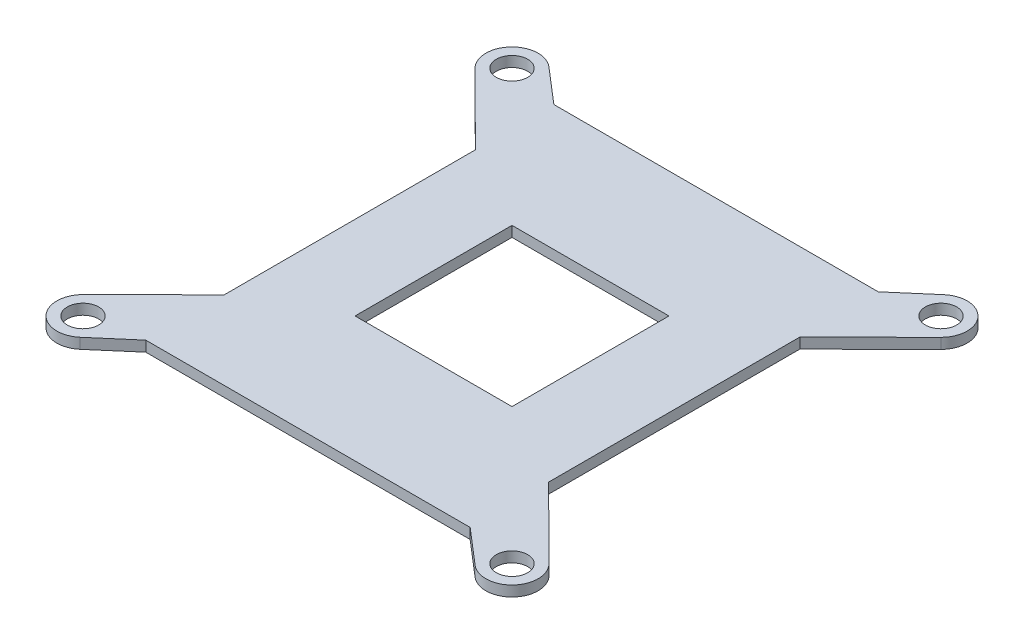
ISO-10303-21;
HEADER;
FILE_DESCRIPTION(('STEP AP214'),'2;1');
FILE_NAME('part.step','',(''),(''),'','','');
FILE_SCHEMA(('AUTOMOTIVE_DESIGN { 1 0 10303 214 1 1 1 1 }'));
ENDSEC;
DATA;
#1=APPLICATION_CONTEXT('core data for automotive mechanical design processes');
#2=APPLICATION_PROTOCOL_DEFINITION('international standard','automotive_design',2000,#1);
#3=PRODUCT_CONTEXT('',#1,'mechanical');
#4=PRODUCT('Part','Part','',(#3));
#5=PRODUCT_RELATED_PRODUCT_CATEGORY('part','',(#4));
#6=PRODUCT_DEFINITION_FORMATION('','',#4);
#7=PRODUCT_DEFINITION_CONTEXT('part definition',#1,'design');
#8=PRODUCT_DEFINITION('design','',#6,#7);
#9=PRODUCT_DEFINITION_SHAPE('','',#8);
#10=(LENGTH_UNIT() NAMED_UNIT(*) SI_UNIT(.MILLI.,.METRE.));
#11=(NAMED_UNIT(*) PLANE_ANGLE_UNIT() SI_UNIT($,.RADIAN.));
#12=(NAMED_UNIT(*) SI_UNIT($,.STERADIAN.) SOLID_ANGLE_UNIT());
#13=UNCERTAINTY_MEASURE_WITH_UNIT(LENGTH_MEASURE(1.E-05),#10,'distance_accuracy_value','');
#14=(GEOMETRIC_REPRESENTATION_CONTEXT(3) GLOBAL_UNCERTAINTY_ASSIGNED_CONTEXT((#13)) GLOBAL_UNIT_ASSIGNED_CONTEXT((#10,
#11,#12)) REPRESENTATION_CONTEXT('',''));
#15=CARTESIAN_POINT('',(0.,0.,0.));
#16=DIRECTION('',(0.,0.,1.));
#17=DIRECTION('',(1.,0.,0.));
#18=AXIS2_PLACEMENT_3D('',#15,#16,#17);
#19=CARTESIAN_POINT('',(41.0000000000008,2.,41.));
#20=DIRECTION('',(0.,1.,0.));
#21=DIRECTION('',(0.,0.,1.));
#22=AXIS2_PLACEMENT_3D('',#19,#20,#21);
#23=PLANE('',#22);
#24=CARTESIAN_POINT('',(41.,2.,41.));
#25=DIRECTION('',(0.,1.,0.));
#26=DIRECTION('',(0.,0.,1.));
#27=AXIS2_PLACEMENT_3D('',#24,#25,#26);
#28=CIRCLE('',#27,3.00000000000082);
#29=CARTESIAN_POINT('',(41.,2.,44.0000000000008));
#30=VERTEX_POINT('',#29);
#31=EDGE_CURVE('E636',#30,#30,#28,.T.);
#32=ORIENTED_EDGE('',*,*,#31,.F.);
#33=EDGE_LOOP('',(#32));
#34=FACE_BOUND('',#33,.T.);
#35=DIRECTION('',(-1.,0.,0.));
#36=VECTOR('',#35,1.);
#37=CARTESIAN_POINT('',(-15.,2.,-15.));
#38=LINE('',#37,#36);
#39=CARTESIAN_POINT('',(15.,2.,-15.));
#40=VERTEX_POINT('',#39);
#41=CARTESIAN_POINT('',(-15.,2.,-15.));
#42=VERTEX_POINT('',#41);
#43=EDGE_CURVE('E178',#40,#42,#38,.T.);
#44=ORIENTED_EDGE('',*,*,#43,.F.);
#45=DIRECTION('',(0.,0.,-1.));
#46=VECTOR('',#45,1.);
#47=CARTESIAN_POINT('',(15.,2.,-15.));
#48=LINE('',#47,#46);
#49=CARTESIAN_POINT('',(15.,2.,15.));
#50=VERTEX_POINT('',#49);
#51=EDGE_CURVE('E170',#50,#40,#48,.T.);
#52=ORIENTED_EDGE('',*,*,#51,.F.);
#53=DIRECTION('',(1.,0.,0.));
#54=VECTOR('',#53,1.);
#55=CARTESIAN_POINT('',(-15.,2.,15.));
#56=LINE('',#55,#54);
#57=CARTESIAN_POINT('',(-15.,2.,15.));
#58=VERTEX_POINT('',#57);
#59=EDGE_CURVE('E193',#58,#50,#56,.T.);
#60=ORIENTED_EDGE('',*,*,#59,.F.);
#61=DIRECTION('',(0.,0.,1.));
#62=VECTOR('',#61,1.);
#63=CARTESIAN_POINT('',(-15.,2.,-15.));
#64=LINE('',#63,#62);
#65=EDGE_CURVE('E191',#42,#58,#64,.T.);
#66=ORIENTED_EDGE('',*,*,#65,.F.);
#67=EDGE_LOOP('',(#44,#52,#60,#66));
#68=FACE_BOUND('',#67,.T.);
#69=CARTESIAN_POINT('',(-41.,2.,-41.));
#70=DIRECTION('',(0.,1.,0.));
#71=DIRECTION('',(0.,0.,1.));
#72=AXIS2_PLACEMENT_3D('',#69,#70,#71);
#73=CIRCLE('',#72,3.);
#74=CARTESIAN_POINT('',(-41.,2.,-38.));
#75=VERTEX_POINT('',#74);
#76=EDGE_CURVE('E209',#75,#75,#73,.T.);
#77=ORIENTED_EDGE('',*,*,#76,.F.);
#78=EDGE_LOOP('',(#77));
#79=FACE_BOUND('',#78,.T.);
#80=DIRECTION('',(0.758480232434231,0.,0.651696046486792));
#81=VECTOR('',#80,1.);
#82=CARTESIAN_POINT('',(31.,2.,39.));
#83=LINE('',#82,#81);
#84=CARTESIAN_POINT('',(31.,2.,39.));
#85=VERTEX_POINT('',#84);
#86=CARTESIAN_POINT('',(37.7415197675669,2.,44.7924011621712));
#87=VERTEX_POINT('',#86);
#88=EDGE_CURVE('E215',#85,#87,#83,.T.);
#89=ORIENTED_EDGE('',*,*,#88,.T.);
#90=CARTESIAN_POINT('',(41.0000000000008,2.,41.));
#91=DIRECTION('',(0.,1.,0.));
#92=DIRECTION('',(0.,0.,1.));
#93=AXIS2_PLACEMENT_3D('',#90,#91,#92);
#94=CIRCLE('',#93,5.);
#95=CARTESIAN_POINT('',(44.5262124483524,2.,37.4551691480283));
#96=VERTEX_POINT('',#95);
#97=EDGE_CURVE('E218',#87,#96,#94,.T.);
#98=ORIENTED_EDGE('',*,*,#97,.T.);
#99=DIRECTION('',(-0.708966170394338,0.,-0.705242489670317));
#100=VECTOR('',#99,1.);
#101=CARTESIAN_POINT('',(31.,2.,24.));
#102=LINE('',#101,#100);
#103=CARTESIAN_POINT('',(31.,2.,24.));
#104=VERTEX_POINT('',#103);
#105=EDGE_CURVE('E221',#96,#104,#102,.T.);
#106=ORIENTED_EDGE('',*,*,#105,.T.);
#107=DIRECTION('',(0.,0.,-1.));
#108=VECTOR('',#107,1.);
#109=CARTESIAN_POINT('',(31.,2.,-24.));
#110=LINE('',#109,#108);
#111=CARTESIAN_POINT('',(31.,2.,-24.));
#112=VERTEX_POINT('',#111);
#113=EDGE_CURVE('E223',#104,#112,#110,.T.);
#114=ORIENTED_EDGE('',*,*,#113,.T.);
#115=DIRECTION('',(0.708966170394317,0.,-0.705242489670338));
#116=VECTOR('',#115,1.);
#117=CARTESIAN_POINT('',(31.,2.,-24.));
#118=LINE('',#117,#116);
#119=CARTESIAN_POINT('',(44.5262124483517,2.,-37.4551691480284));
#120=VERTEX_POINT('',#119);
#121=EDGE_CURVE('E225',#112,#120,#118,.T.);
#122=ORIENTED_EDGE('',*,*,#121,.T.);
#123=CARTESIAN_POINT('',(41.,2.,-41.));
#124=DIRECTION('',(0.,1.,0.));
#125=DIRECTION('',(0.,0.,1.));
#126=AXIS2_PLACEMENT_3D('',#123,#124,#125);
#127=CIRCLE('',#126,5.);
#128=CARTESIAN_POINT('',(37.7415197675658,2.,-44.7924011621709));
#129=VERTEX_POINT('',#128);
#130=EDGE_CURVE('E227',#120,#129,#127,.T.);
#131=ORIENTED_EDGE('',*,*,#130,.T.);
#132=DIRECTION('',(-0.758480232434191,0.,0.651696046486839));
#133=VECTOR('',#132,1.);
#134=CARTESIAN_POINT('',(31.,2.,-39.));
#135=LINE('',#134,#133);
#136=CARTESIAN_POINT('',(31.,2.,-39.));
#137=VERTEX_POINT('',#136);
#138=EDGE_CURVE('E229',#129,#137,#135,.T.);
#139=ORIENTED_EDGE('',*,*,#138,.T.);
#140=DIRECTION('',(-1.,0.,0.));
#141=VECTOR('',#140,1.);
#142=CARTESIAN_POINT('',(-31.,2.,-39.));
#143=LINE('',#142,#141);
#144=CARTESIAN_POINT('',(-31.,2.,-39.));
#145=VERTEX_POINT('',#144);
#146=EDGE_CURVE('E231',#137,#145,#143,.T.);
#147=ORIENTED_EDGE('',*,*,#146,.T.);
#148=DIRECTION('',(-0.758480232434192,0.,-0.651696046486837));
#149=VECTOR('',#148,1.);
#150=CARTESIAN_POINT('',(-31.,2.,-39.));
#151=LINE('',#150,#149);
#152=CARTESIAN_POINT('',(-37.7415197675658,2.,-44.792401162171));
#153=VERTEX_POINT('',#152);
#154=EDGE_CURVE('E233',#145,#153,#151,.T.);
#155=ORIENTED_EDGE('',*,*,#154,.T.);
#156=CARTESIAN_POINT('',(-41.,2.,-41.));
#157=DIRECTION('',(0.,1.,0.));
#158=DIRECTION('',(0.,0.,1.));
#159=AXIS2_PLACEMENT_3D('',#156,#157,#158);
#160=CIRCLE('',#159,5.00000000000001);
#161=CARTESIAN_POINT('',(-44.5262124483517,2.,-37.4551691480284));
#162=VERTEX_POINT('',#161);
#163=EDGE_CURVE('E235',#153,#162,#160,.T.);
#164=ORIENTED_EDGE('',*,*,#163,.T.);
#165=DIRECTION('',(0.708966170394318,0.,0.705242489670337));
#166=VECTOR('',#165,1.);
#167=CARTESIAN_POINT('',(-31.,2.,-24.));
#168=LINE('',#167,#166);
#169=CARTESIAN_POINT('',(-31.,2.,-24.));
#170=VERTEX_POINT('',#169);
#171=EDGE_CURVE('E237',#162,#170,#168,.T.);
#172=ORIENTED_EDGE('',*,*,#171,.T.);
#173=DIRECTION('',(0.,0.,1.));
#174=VECTOR('',#173,1.);
#175=CARTESIAN_POINT('',(-31.,2.,-24.));
#176=LINE('',#175,#174);
#177=CARTESIAN_POINT('',(-31.,2.,24.));
#178=VERTEX_POINT('',#177);
#179=EDGE_CURVE('E239',#170,#178,#176,.T.);
#180=ORIENTED_EDGE('',*,*,#179,.T.);
#181=DIRECTION('',(-0.708966170394295,0.,0.70524248967036));
#182=VECTOR('',#181,1.);
#183=CARTESIAN_POINT('',(-31.,2.,24.));
#184=LINE('',#183,#182);
#185=CARTESIAN_POINT('',(-44.526212448351,2.,37.4551691480285));
#186=VERTEX_POINT('',#185);
#187=EDGE_CURVE('E241',#178,#186,#184,.T.);
#188=ORIENTED_EDGE('',*,*,#187,.T.);
#189=CARTESIAN_POINT('',(-40.9999999999992,2.,41.));
#190=DIRECTION('',(0.,1.,0.));
#191=DIRECTION('',(0.,0.,1.));
#192=AXIS2_PLACEMENT_3D('',#189,#190,#191);
#193=CIRCLE('',#192,5.);
#194=CARTESIAN_POINT('',(-37.7415197675647,2.,44.7924011621708));
#195=VERTEX_POINT('',#194);
#196=EDGE_CURVE('E243',#186,#195,#193,.T.);
#197=ORIENTED_EDGE('',*,*,#196,.T.);
#198=DIRECTION('',(0.758480232434151,0.,-0.651696046486885));
#199=VECTOR('',#198,1.);
#200=CARTESIAN_POINT('',(-31.,2.,39.));
#201=LINE('',#200,#199);
#202=CARTESIAN_POINT('',(-31.,2.,39.));
#203=VERTEX_POINT('',#202);
#204=EDGE_CURVE('E245',#195,#203,#201,.T.);
#205=ORIENTED_EDGE('',*,*,#204,.T.);
#206=DIRECTION('',(1.,0.,0.));
#207=VECTOR('',#206,1.);
#208=CARTESIAN_POINT('',(-31.,2.,39.));
#209=LINE('',#208,#207);
#210=EDGE_CURVE('E247',#203,#85,#209,.T.);
#211=ORIENTED_EDGE('',*,*,#210,.T.);
#212=EDGE_LOOP('',(#89,#98,#106,#114,#122,#131,#139,#147,#155,#164,#172,#180,#188,#197,#205,#211));
#213=FACE_BOUND('',#212,.T.);
#214=CARTESIAN_POINT('',(41.,2.,-41.));
#215=DIRECTION('',(0.,1.,0.));
#216=DIRECTION('',(0.,0.,1.));
#217=AXIS2_PLACEMENT_3D('',#214,#215,#216);
#218=CIRCLE('',#217,3.);
#219=CARTESIAN_POINT('',(41.,2.,-38.));
#220=VERTEX_POINT('',#219);
#221=EDGE_CURVE('E199',#220,#220,#218,.T.);
#222=ORIENTED_EDGE('',*,*,#221,.F.);
#223=EDGE_LOOP('',(#222));
#224=FACE_BOUND('',#223,.T.);
#225=CARTESIAN_POINT('',(-41.,2.,41.));
#226=DIRECTION('',(0.,1.,0.));
#227=DIRECTION('',(0.,0.,1.));
#228=AXIS2_PLACEMENT_3D('',#225,#226,#227);
#229=CIRCLE('',#228,3.00000000000082);
#230=CARTESIAN_POINT('',(-41.,2.,44.0000000000008));
#231=VERTEX_POINT('',#230);
#232=EDGE_CURVE('E627',#231,#231,#229,.T.);
#233=ORIENTED_EDGE('',*,*,#232,.F.);
#234=EDGE_LOOP('',(#233));
#235=FACE_BOUND('',#234,.T.);
#236=ADVANCED_FACE('F33',(#34,#68,#79,#213,#224,#235),#23,.T.);
#237=CARTESIAN_POINT('',(41.0000000000008,0.,41.));
#238=DIRECTION('',(0.,1.,0.));
#239=DIRECTION('',(0.,0.,1.));
#240=AXIS2_PLACEMENT_3D('',#237,#238,#239);
#241=PLANE('',#240);
#242=CARTESIAN_POINT('',(-41.,0.,-41.));
#243=DIRECTION('',(0.,1.,0.));
#244=DIRECTION('',(0.,0.,1.));
#245=AXIS2_PLACEMENT_3D('',#242,#243,#244);
#246=CIRCLE('',#245,3.);
#247=CARTESIAN_POINT('',(-41.,0.,-38.));
#248=VERTEX_POINT('',#247);
#249=EDGE_CURVE('E186',#248,#248,#246,.T.);
#250=ORIENTED_EDGE('',*,*,#249,.T.);
#251=EDGE_LOOP('',(#250));
#252=FACE_BOUND('',#251,.T.);
#253=DIRECTION('',(0.758480232434231,0.,0.651696046486792));
#254=VECTOR('',#253,1.);
#255=CARTESIAN_POINT('',(31.,0.,39.));
#256=LINE('',#255,#254);
#257=CARTESIAN_POINT('',(31.,0.,39.));
#258=VERTEX_POINT('',#257);
#259=CARTESIAN_POINT('',(37.7415197675669,0.,44.7924011621712));
#260=VERTEX_POINT('',#259);
#261=EDGE_CURVE('E212',#258,#260,#256,.T.);
#262=ORIENTED_EDGE('',*,*,#261,.F.);
#263=DIRECTION('',(1.,0.,0.));
#264=VECTOR('',#263,1.);
#265=CARTESIAN_POINT('',(-31.,0.,39.));
#266=LINE('',#265,#264);
#267=CARTESIAN_POINT('',(-31.,0.,39.));
#268=VERTEX_POINT('',#267);
#269=EDGE_CURVE('E219',#268,#258,#266,.T.);
#270=ORIENTED_EDGE('',*,*,#269,.F.);
#271=DIRECTION('',(0.758480232434151,0.,-0.651696046486885));
#272=VECTOR('',#271,1.);
#273=CARTESIAN_POINT('',(-31.,0.,39.));
#274=LINE('',#273,#272);
#275=CARTESIAN_POINT('',(-37.7415197675647,0.,44.7924011621708));
#276=VERTEX_POINT('',#275);
#277=EDGE_CURVE('E278',#276,#268,#274,.T.);
#278=ORIENTED_EDGE('',*,*,#277,.F.);
#279=CARTESIAN_POINT('',(-40.9999999999992,0.,41.));
#280=DIRECTION('',(0.,1.,0.));
#281=DIRECTION('',(0.,0.,1.));
#282=AXIS2_PLACEMENT_3D('',#279,#280,#281);
#283=CIRCLE('',#282,5.);
#284=CARTESIAN_POINT('',(-44.526212448351,0.,37.4551691480285));
#285=VERTEX_POINT('',#284);
#286=EDGE_CURVE('E276',#285,#276,#283,.T.);
#287=ORIENTED_EDGE('',*,*,#286,.F.);
#288=DIRECTION('',(-0.708966170394295,0.,0.70524248967036));
#289=VECTOR('',#288,1.);
#290=CARTESIAN_POINT('',(-31.,0.,24.));
#291=LINE('',#290,#289);
#292=CARTESIAN_POINT('',(-31.,0.,24.));
#293=VERTEX_POINT('',#292);
#294=EDGE_CURVE('E274',#293,#285,#291,.T.);
#295=ORIENTED_EDGE('',*,*,#294,.F.);
#296=DIRECTION('',(0.,0.,1.));
#297=VECTOR('',#296,1.);
#298=CARTESIAN_POINT('',(-31.,0.,-24.));
#299=LINE('',#298,#297);
#300=CARTESIAN_POINT('',(-31.,0.,-24.));
#301=VERTEX_POINT('',#300);
#302=EDGE_CURVE('E272',#301,#293,#299,.T.);
#303=ORIENTED_EDGE('',*,*,#302,.F.);
#304=DIRECTION('',(0.708966170394318,0.,0.705242489670337));
#305=VECTOR('',#304,1.);
#306=CARTESIAN_POINT('',(-31.,0.,-24.));
#307=LINE('',#306,#305);
#308=CARTESIAN_POINT('',(-44.5262124483517,0.,-37.4551691480284));
#309=VERTEX_POINT('',#308);
#310=EDGE_CURVE('E270',#309,#301,#307,.T.);
#311=ORIENTED_EDGE('',*,*,#310,.F.);
#312=CARTESIAN_POINT('',(-41.,0.,-41.));
#313=DIRECTION('',(0.,1.,0.));
#314=DIRECTION('',(0.,0.,1.));
#315=AXIS2_PLACEMENT_3D('',#312,#313,#314);
#316=CIRCLE('',#315,5.00000000000001);
#317=CARTESIAN_POINT('',(-37.7415197675658,0.,-44.792401162171));
#318=VERTEX_POINT('',#317);
#319=EDGE_CURVE('E268',#318,#309,#316,.T.);
#320=ORIENTED_EDGE('',*,*,#319,.F.);
#321=DIRECTION('',(-0.758480232434192,0.,-0.651696046486837));
#322=VECTOR('',#321,1.);
#323=CARTESIAN_POINT('',(-31.,0.,-39.));
#324=LINE('',#323,#322);
#325=CARTESIAN_POINT('',(-31.,0.,-39.));
#326=VERTEX_POINT('',#325);
#327=EDGE_CURVE('E266',#326,#318,#324,.T.);
#328=ORIENTED_EDGE('',*,*,#327,.F.);
#329=DIRECTION('',(-1.,0.,0.));
#330=VECTOR('',#329,1.);
#331=CARTESIAN_POINT('',(-31.,0.,-39.));
#332=LINE('',#331,#330);
#333=CARTESIAN_POINT('',(31.,0.,-39.));
#334=VERTEX_POINT('',#333);
#335=EDGE_CURVE('E264',#334,#326,#332,.T.);
#336=ORIENTED_EDGE('',*,*,#335,.F.);
#337=DIRECTION('',(-0.758480232434191,0.,0.651696046486839));
#338=VECTOR('',#337,1.);
#339=CARTESIAN_POINT('',(31.,0.,-39.));
#340=LINE('',#339,#338);
#341=CARTESIAN_POINT('',(37.7415197675658,0.,-44.7924011621709));
#342=VERTEX_POINT('',#341);
#343=EDGE_CURVE('E262',#342,#334,#340,.T.);
#344=ORIENTED_EDGE('',*,*,#343,.F.);
#345=CARTESIAN_POINT('',(41.,0.,-41.));
#346=DIRECTION('',(0.,1.,0.));
#347=DIRECTION('',(0.,0.,1.));
#348=AXIS2_PLACEMENT_3D('',#345,#346,#347);
#349=CIRCLE('',#348,5.);
#350=CARTESIAN_POINT('',(44.5262124483517,0.,-37.4551691480284));
#351=VERTEX_POINT('',#350);
#352=EDGE_CURVE('E260',#351,#342,#349,.T.);
#353=ORIENTED_EDGE('',*,*,#352,.F.);
#354=DIRECTION('',(0.708966170394317,0.,-0.705242489670338));
#355=VECTOR('',#354,1.);
#356=CARTESIAN_POINT('',(31.,0.,-24.));
#357=LINE('',#356,#355);
#358=CARTESIAN_POINT('',(31.,0.,-24.));
#359=VERTEX_POINT('',#358);
#360=EDGE_CURVE('E258',#359,#351,#357,.T.);
#361=ORIENTED_EDGE('',*,*,#360,.F.);
#362=DIRECTION('',(0.,0.,-1.));
#363=VECTOR('',#362,1.);
#364=CARTESIAN_POINT('',(31.,0.,-24.));
#365=LINE('',#364,#363);
#366=CARTESIAN_POINT('',(31.,0.,24.));
#367=VERTEX_POINT('',#366);
#368=EDGE_CURVE('E256',#367,#359,#365,.T.);
#369=ORIENTED_EDGE('',*,*,#368,.F.);
#370=DIRECTION('',(-0.708966170394338,0.,-0.705242489670317));
#371=VECTOR('',#370,1.);
#372=CARTESIAN_POINT('',(31.,0.,24.));
#373=LINE('',#372,#371);
#374=CARTESIAN_POINT('',(44.5262124483524,0.,37.4551691480283));
#375=VERTEX_POINT('',#374);
#376=EDGE_CURVE('E254',#375,#367,#373,.T.);
#377=ORIENTED_EDGE('',*,*,#376,.F.);
#378=CARTESIAN_POINT('',(41.0000000000008,0.,41.));
#379=DIRECTION('',(0.,1.,0.));
#380=DIRECTION('',(0.,0.,1.));
#381=AXIS2_PLACEMENT_3D('',#378,#379,#380);
#382=CIRCLE('',#381,5.);
#383=EDGE_CURVE('E252',#260,#375,#382,.T.);
#384=ORIENTED_EDGE('',*,*,#383,.F.);
#385=EDGE_LOOP('',(#262,#270,#278,#287,#295,#303,#311,#320,#328,#336,#344,#353,#361,#369,#377,#384));
#386=FACE_BOUND('',#385,.T.);
#387=DIRECTION('',(0.,0.,-1.));
#388=VECTOR('',#387,1.);
#389=CARTESIAN_POINT('',(15.,0.,-15.));
#390=LINE('',#389,#388);
#391=CARTESIAN_POINT('',(15.,0.,15.));
#392=VERTEX_POINT('',#391);
#393=CARTESIAN_POINT('',(15.,0.,-15.));
#394=VERTEX_POINT('',#393);
#395=EDGE_CURVE('E56',#392,#394,#390,.T.);
#396=ORIENTED_EDGE('',*,*,#395,.T.);
#397=DIRECTION('',(-1.,0.,0.));
#398=VECTOR('',#397,1.);
#399=CARTESIAN_POINT('',(-15.,0.,-15.));
#400=LINE('',#399,#398);
#401=CARTESIAN_POINT('',(-15.,0.,-15.));
#402=VERTEX_POINT('',#401);
#403=EDGE_CURVE('E185',#394,#402,#400,.T.);
#404=ORIENTED_EDGE('',*,*,#403,.T.);
#405=DIRECTION('',(0.,0.,1.));
#406=VECTOR('',#405,1.);
#407=CARTESIAN_POINT('',(-15.,0.,-15.));
#408=LINE('',#407,#406);
#409=CARTESIAN_POINT('',(-15.,0.,15.));
#410=VERTEX_POINT('',#409);
#411=EDGE_CURVE('E201',#402,#410,#408,.T.);
#412=ORIENTED_EDGE('',*,*,#411,.T.);
#413=DIRECTION('',(1.,0.,0.));
#414=VECTOR('',#413,1.);
#415=CARTESIAN_POINT('',(-15.,0.,15.));
#416=LINE('',#415,#414);
#417=EDGE_CURVE('E179',#410,#392,#416,.T.);
#418=ORIENTED_EDGE('',*,*,#417,.T.);
#419=EDGE_LOOP('',(#396,#404,#412,#418));
#420=FACE_BOUND('',#419,.T.);
#421=CARTESIAN_POINT('',(41.,0.,-41.));
#422=DIRECTION('',(0.,1.,0.));
#423=DIRECTION('',(0.,0.,1.));
#424=AXIS2_PLACEMENT_3D('',#421,#422,#423);
#425=CIRCLE('',#424,3.);
#426=CARTESIAN_POINT('',(41.,0.,-38.));
#427=VERTEX_POINT('',#426);
#428=EDGE_CURVE('E639',#427,#427,#425,.T.);
#429=ORIENTED_EDGE('',*,*,#428,.T.);
#430=EDGE_LOOP('',(#429));
#431=FACE_BOUND('',#430,.T.);
#432=CARTESIAN_POINT('',(41.,0.,41.));
#433=DIRECTION('',(0.,1.,0.));
#434=DIRECTION('',(0.,0.,1.));
#435=AXIS2_PLACEMENT_3D('',#432,#433,#434);
#436=CIRCLE('',#435,3.00000000000082);
#437=CARTESIAN_POINT('',(41.,0.,44.0000000000008));
#438=VERTEX_POINT('',#437);
#439=EDGE_CURVE('E633',#438,#438,#436,.T.);
#440=ORIENTED_EDGE('',*,*,#439,.T.);
#441=EDGE_LOOP('',(#440));
#442=FACE_BOUND('',#441,.T.);
#443=CARTESIAN_POINT('',(-41.,0.,41.));
#444=DIRECTION('',(0.,1.,0.));
#445=DIRECTION('',(0.,0.,1.));
#446=AXIS2_PLACEMENT_3D('',#443,#444,#445);
#447=CIRCLE('',#446,3.00000000000082);
#448=CARTESIAN_POINT('',(-41.,0.,44.0000000000008));
#449=VERTEX_POINT('',#448);
#450=EDGE_CURVE('E630',#449,#449,#447,.T.);
#451=ORIENTED_EDGE('',*,*,#450,.T.);
#452=EDGE_LOOP('',(#451));
#453=FACE_BOUND('',#452,.T.);
#454=ADVANCED_FACE('F332',(#252,#386,#420,#431,#442,#453),#241,.F.);
#455=CARTESIAN_POINT('',(31.,2.,39.));
#456=DIRECTION('',(0.651696046486792,0.,-0.758480232434231));
#457=DIRECTION('',(-0.758480232434231,0.,-0.651696046486792));
#458=AXIS2_PLACEMENT_3D('',#455,#456,#457);
#459=PLANE('',#458);
#460=ORIENTED_EDGE('',*,*,#261,.T.);
#461=DIRECTION('',(0.,-1.,0.));
#462=VECTOR('',#461,1.);
#463=CARTESIAN_POINT('',(37.7415197675669,2.,44.7924011621712));
#464=LINE('',#463,#462);
#465=EDGE_CURVE('E11',#87,#260,#464,.T.);
#466=ORIENTED_EDGE('',*,*,#465,.F.);
#467=ORIENTED_EDGE('',*,*,#88,.F.);
#468=DIRECTION('',(0.,-1.,0.));
#469=VECTOR('',#468,1.);
#470=CARTESIAN_POINT('',(31.,2.,39.));
#471=LINE('',#470,#469);
#472=EDGE_CURVE('E249',#85,#258,#471,.T.);
#473=ORIENTED_EDGE('',*,*,#472,.T.);
#474=EDGE_LOOP('',(#460,#466,#467,#473));
#475=FACE_BOUND('',#474,.T.);
#476=ADVANCED_FACE('F35',(#475),#459,.F.);
#477=CARTESIAN_POINT('',(41.0000000000008,2.,41.));
#478=DIRECTION('',(0.,-1.,0.));
#479=DIRECTION('',(0.,0.,-1.));
#480=AXIS2_PLACEMENT_3D('',#477,#478,#479);
#481=CYLINDRICAL_SURFACE('',#480,5.);
#482=ORIENTED_EDGE('',*,*,#383,.T.);
#483=DIRECTION('',(0.,-1.,0.));
#484=VECTOR('',#483,1.);
#485=CARTESIAN_POINT('',(44.5262124483524,2.,37.4551691480283));
#486=LINE('',#485,#484);
#487=EDGE_CURVE('E41',#96,#375,#486,.T.);
#488=ORIENTED_EDGE('',*,*,#487,.F.);
#489=ORIENTED_EDGE('',*,*,#97,.F.);
#490=ORIENTED_EDGE('',*,*,#465,.T.);
#491=EDGE_LOOP('',(#482,#488,#489,#490));
#492=FACE_BOUND('',#491,.T.);
#493=ADVANCED_FACE('F350',(#492),#481,.T.);
#494=CARTESIAN_POINT('',(31.,2.,24.));
#495=DIRECTION('',(-0.705242489670317,0.,0.708966170394338));
#496=DIRECTION('',(0.708966170394338,0.,0.705242489670317));
#497=AXIS2_PLACEMENT_3D('',#494,#495,#496);
#498=PLANE('',#497);
#499=ORIENTED_EDGE('',*,*,#376,.T.);
#500=DIRECTION('',(0.,-1.,0.));
#501=VECTOR('',#500,1.);
#502=CARTESIAN_POINT('',(31.,2.,24.));
#503=LINE('',#502,#501);
#504=EDGE_CURVE('E319',#104,#367,#503,.T.);
#505=ORIENTED_EDGE('',*,*,#504,.F.);
#506=ORIENTED_EDGE('',*,*,#105,.F.);
#507=ORIENTED_EDGE('',*,*,#487,.T.);
#508=EDGE_LOOP('',(#499,#505,#506,#507));
#509=FACE_BOUND('',#508,.T.);
#510=ADVANCED_FACE('F326',(#509),#498,.F.);
#511=CARTESIAN_POINT('',(31.,2.,-24.));
#512=DIRECTION('',(-1.,0.,0.));
#513=DIRECTION('',(0.,0.,1.));
#514=AXIS2_PLACEMENT_3D('',#511,#512,#513);
#515=PLANE('',#514);
#516=ORIENTED_EDGE('',*,*,#368,.T.);
#517=DIRECTION('',(0.,-1.,0.));
#518=VECTOR('',#517,1.);
#519=CARTESIAN_POINT('',(31.,2.,-24.));
#520=LINE('',#519,#518);
#521=EDGE_CURVE('E316',#112,#359,#520,.T.);
#522=ORIENTED_EDGE('',*,*,#521,.F.);
#523=ORIENTED_EDGE('',*,*,#113,.F.);
#524=ORIENTED_EDGE('',*,*,#504,.T.);
#525=EDGE_LOOP('',(#516,#522,#523,#524));
#526=FACE_BOUND('',#525,.T.);
#527=ADVANCED_FACE('F338',(#526),#515,.F.);
#528=CARTESIAN_POINT('',(31.,2.,-24.));
#529=DIRECTION('',(-0.705242489670338,0.,-0.708966170394317));
#530=DIRECTION('',(-0.708966170394317,0.,0.705242489670338));
#531=AXIS2_PLACEMENT_3D('',#528,#529,#530);
#532=PLANE('',#531);
#533=ORIENTED_EDGE('',*,*,#360,.T.);
#534=DIRECTION('',(0.,-1.,0.));
#535=VECTOR('',#534,1.);
#536=CARTESIAN_POINT('',(44.5262124483517,2.,-37.4551691480284));
#537=LINE('',#536,#535);
#538=EDGE_CURVE('E313',#120,#351,#537,.T.);
#539=ORIENTED_EDGE('',*,*,#538,.F.);
#540=ORIENTED_EDGE('',*,*,#121,.F.);
#541=ORIENTED_EDGE('',*,*,#521,.T.);
#542=EDGE_LOOP('',(#533,#539,#540,#541));
#543=FACE_BOUND('',#542,.T.);
#544=ADVANCED_FACE('F342',(#543),#532,.F.);
#545=CARTESIAN_POINT('',(41.,2.,-41.));
#546=DIRECTION('',(0.,-1.,0.));
#547=DIRECTION('',(0.,0.,-1.));
#548=AXIS2_PLACEMENT_3D('',#545,#546,#547);
#549=CYLINDRICAL_SURFACE('',#548,5.);
#550=ORIENTED_EDGE('',*,*,#352,.T.);
#551=DIRECTION('',(0.,-1.,0.));
#552=VECTOR('',#551,1.);
#553=CARTESIAN_POINT('',(37.7415197675658,2.,-44.7924011621709));
#554=LINE('',#553,#552);
#555=EDGE_CURVE('E310',#129,#342,#554,.T.);
#556=ORIENTED_EDGE('',*,*,#555,.F.);
#557=ORIENTED_EDGE('',*,*,#130,.F.);
#558=ORIENTED_EDGE('',*,*,#538,.T.);
#559=EDGE_LOOP('',(#550,#556,#557,#558));
#560=FACE_BOUND('',#559,.T.);
#561=ADVANCED_FACE('F403',(#560),#549,.T.);
#562=CARTESIAN_POINT('',(31.,2.,-39.));
#563=DIRECTION('',(0.651696046486838,0.,0.758480232434191));
#564=DIRECTION('',(0.758480232434191,0.,-0.651696046486838));
#565=AXIS2_PLACEMENT_3D('',#562,#563,#564);
#566=PLANE('',#565);
#567=ORIENTED_EDGE('',*,*,#343,.T.);
#568=DIRECTION('',(0.,-1.,0.));
#569=VECTOR('',#568,1.);
#570=CARTESIAN_POINT('',(31.,2.,-39.));
#571=LINE('',#570,#569);
#572=EDGE_CURVE('E307',#137,#334,#571,.T.);
#573=ORIENTED_EDGE('',*,*,#572,.F.);
#574=ORIENTED_EDGE('',*,*,#138,.F.);
#575=ORIENTED_EDGE('',*,*,#555,.T.);
#576=EDGE_LOOP('',(#567,#573,#574,#575));
#577=FACE_BOUND('',#576,.T.);
#578=ADVANCED_FACE('F400',(#577),#566,.F.);
#579=CARTESIAN_POINT('',(-31.,2.,-39.));
#580=DIRECTION('',(0.,0.,1.));
#581=DIRECTION('',(1.,0.,0.));
#582=AXIS2_PLACEMENT_3D('',#579,#580,#581);
#583=PLANE('',#582);
#584=ORIENTED_EDGE('',*,*,#335,.T.);
#585=DIRECTION('',(0.,-1.,0.));
#586=VECTOR('',#585,1.);
#587=CARTESIAN_POINT('',(-31.,2.,-39.));
#588=LINE('',#587,#586);
#589=EDGE_CURVE('E304',#145,#326,#588,.T.);
#590=ORIENTED_EDGE('',*,*,#589,.F.);
#591=ORIENTED_EDGE('',*,*,#146,.F.);
#592=ORIENTED_EDGE('',*,*,#572,.T.);
#593=EDGE_LOOP('',(#584,#590,#591,#592));
#594=FACE_BOUND('',#593,.T.);
#595=ADVANCED_FACE('F396',(#594),#583,.F.);
#596=CARTESIAN_POINT('',(-31.,2.,-39.));
#597=DIRECTION('',(-0.651696046486837,0.,0.758480232434192));
#598=DIRECTION('',(0.758480232434192,0.,0.651696046486837));
#599=AXIS2_PLACEMENT_3D('',#596,#597,#598);
#600=PLANE('',#599);
#601=ORIENTED_EDGE('',*,*,#327,.T.);
#602=DIRECTION('',(0.,-1.,0.));
#603=VECTOR('',#602,1.);
#604=CARTESIAN_POINT('',(-37.7415197675658,2.,-44.792401162171));
#605=LINE('',#604,#603);
#606=EDGE_CURVE('E301',#153,#318,#605,.T.);
#607=ORIENTED_EDGE('',*,*,#606,.F.);
#608=ORIENTED_EDGE('',*,*,#154,.F.);
#609=ORIENTED_EDGE('',*,*,#589,.T.);
#610=EDGE_LOOP('',(#601,#607,#608,#609));
#611=FACE_BOUND('',#610,.T.);
#612=ADVANCED_FACE('F392',(#611),#600,.F.);
#613=CARTESIAN_POINT('',(-41.,2.,-41.));
#614=DIRECTION('',(0.,-1.,0.));
#615=DIRECTION('',(0.,0.,-1.));
#616=AXIS2_PLACEMENT_3D('',#613,#614,#615);
#617=CYLINDRICAL_SURFACE('',#616,5.00000000000001);
#618=ORIENTED_EDGE('',*,*,#319,.T.);
#619=DIRECTION('',(0.,-1.,0.));
#620=VECTOR('',#619,1.);
#621=CARTESIAN_POINT('',(-44.5262124483517,2.,-37.4551691480284));
#622=LINE('',#621,#620);
#623=EDGE_CURVE('E298',#162,#309,#622,.T.);
#624=ORIENTED_EDGE('',*,*,#623,.F.);
#625=ORIENTED_EDGE('',*,*,#163,.F.);
#626=ORIENTED_EDGE('',*,*,#606,.T.);
#627=EDGE_LOOP('',(#618,#624,#625,#626));
#628=FACE_BOUND('',#627,.T.);
#629=ADVANCED_FACE('F387',(#628),#617,.T.);
#630=CARTESIAN_POINT('',(-31.,2.,-24.));
#631=DIRECTION('',(0.705242489670337,0.,-0.708966170394318));
#632=DIRECTION('',(-0.708966170394318,0.,-0.705242489670337));
#633=AXIS2_PLACEMENT_3D('',#630,#631,#632);
#634=PLANE('',#633);
#635=ORIENTED_EDGE('',*,*,#310,.T.);
#636=DIRECTION('',(0.,-1.,0.));
#637=VECTOR('',#636,1.);
#638=CARTESIAN_POINT('',(-31.,2.,-24.));
#639=LINE('',#638,#637);
#640=EDGE_CURVE('E295',#170,#301,#639,.T.);
#641=ORIENTED_EDGE('',*,*,#640,.F.);
#642=ORIENTED_EDGE('',*,*,#171,.F.);
#643=ORIENTED_EDGE('',*,*,#623,.T.);
#644=EDGE_LOOP('',(#635,#641,#642,#643));
#645=FACE_BOUND('',#644,.T.);
#646=ADVANCED_FACE('F381',(#645),#634,.F.);
#647=CARTESIAN_POINT('',(-31.,2.,-24.));
#648=DIRECTION('',(1.,0.,0.));
#649=DIRECTION('',(0.,0.,-1.));
#650=AXIS2_PLACEMENT_3D('',#647,#648,#649);
#651=PLANE('',#650);
#652=ORIENTED_EDGE('',*,*,#302,.T.);
#653=DIRECTION('',(0.,-1.,0.));
#654=VECTOR('',#653,1.);
#655=CARTESIAN_POINT('',(-31.,2.,24.));
#656=LINE('',#655,#654);
#657=EDGE_CURVE('E292',#178,#293,#656,.T.);
#658=ORIENTED_EDGE('',*,*,#657,.F.);
#659=ORIENTED_EDGE('',*,*,#179,.F.);
#660=ORIENTED_EDGE('',*,*,#640,.T.);
#661=EDGE_LOOP('',(#652,#658,#659,#660));
#662=FACE_BOUND('',#661,.T.);
#663=ADVANCED_FACE('F377',(#662),#651,.F.);
#664=CARTESIAN_POINT('',(-31.,2.,24.));
#665=DIRECTION('',(0.70524248967036,0.,0.708966170394295));
#666=DIRECTION('',(0.708966170394295,0.,-0.70524248967036));
#667=AXIS2_PLACEMENT_3D('',#664,#665,#666);
#668=PLANE('',#667);
#669=ORIENTED_EDGE('',*,*,#294,.T.);
#670=DIRECTION('',(0.,-1.,0.));
#671=VECTOR('',#670,1.);
#672=CARTESIAN_POINT('',(-44.526212448351,2.,37.4551691480285));
#673=LINE('',#672,#671);
#674=EDGE_CURVE('E289',#186,#285,#673,.T.);
#675=ORIENTED_EDGE('',*,*,#674,.F.);
#676=ORIENTED_EDGE('',*,*,#187,.F.);
#677=ORIENTED_EDGE('',*,*,#657,.T.);
#678=EDGE_LOOP('',(#669,#675,#676,#677));
#679=FACE_BOUND('',#678,.T.);
#680=ADVANCED_FACE('F372',(#679),#668,.F.);
#681=CARTESIAN_POINT('',(-40.9999999999992,2.,41.));
#682=DIRECTION('',(0.,-1.,0.));
#683=DIRECTION('',(0.,0.,-1.));
#684=AXIS2_PLACEMENT_3D('',#681,#682,#683);
#685=CYLINDRICAL_SURFACE('',#684,5.);
#686=ORIENTED_EDGE('',*,*,#286,.T.);
#687=DIRECTION('',(0.,-1.,0.));
#688=VECTOR('',#687,1.);
#689=CARTESIAN_POINT('',(-37.7415197675647,2.,44.7924011621708));
#690=LINE('',#689,#688);
#691=EDGE_CURVE('E286',#195,#276,#690,.T.);
#692=ORIENTED_EDGE('',*,*,#691,.F.);
#693=ORIENTED_EDGE('',*,*,#196,.F.);
#694=ORIENTED_EDGE('',*,*,#674,.T.);
#695=EDGE_LOOP('',(#686,#692,#693,#694));
#696=FACE_BOUND('',#695,.T.);
#697=ADVANCED_FACE('F366',(#696),#685,.T.);
#698=CARTESIAN_POINT('',(-31.,2.,39.));
#699=DIRECTION('',(-0.651696046486885,0.,-0.758480232434151));
#700=DIRECTION('',(-0.758480232434151,0.,0.651696046486885));
#701=AXIS2_PLACEMENT_3D('',#698,#699,#700);
#702=PLANE('',#701);
#703=ORIENTED_EDGE('',*,*,#277,.T.);
#704=DIRECTION('',(0.,-1.,0.));
#705=VECTOR('',#704,1.);
#706=CARTESIAN_POINT('',(-31.,2.,39.));
#707=LINE('',#706,#705);
#708=EDGE_CURVE('E283',#203,#268,#707,.T.);
#709=ORIENTED_EDGE('',*,*,#708,.F.);
#710=ORIENTED_EDGE('',*,*,#204,.F.);
#711=ORIENTED_EDGE('',*,*,#691,.T.);
#712=EDGE_LOOP('',(#703,#709,#710,#711));
#713=FACE_BOUND('',#712,.T.);
#714=ADVANCED_FACE('F362',(#713),#702,.F.);
#715=CARTESIAN_POINT('',(-31.,2.,39.));
#716=DIRECTION('',(0.,0.,-1.));
#717=DIRECTION('',(-1.,0.,0.));
#718=AXIS2_PLACEMENT_3D('',#715,#716,#717);
#719=PLANE('',#718);
#720=ORIENTED_EDGE('',*,*,#269,.T.);
#721=ORIENTED_EDGE('',*,*,#472,.F.);
#722=ORIENTED_EDGE('',*,*,#210,.F.);
#723=ORIENTED_EDGE('',*,*,#708,.T.);
#724=EDGE_LOOP('',(#720,#721,#722,#723));
#725=FACE_BOUND('',#724,.T.);
#726=ADVANCED_FACE('F357',(#725),#719,.F.);
#727=CARTESIAN_POINT('',(-41.,2.,-41.));
#728=DIRECTION('',(0.,-1.,0.));
#729=DIRECTION('',(0.,0.,-1.));
#730=AXIS2_PLACEMENT_3D('',#727,#728,#729);
#731=CYLINDRICAL_SURFACE('',#730,3.);
#732=ORIENTED_EDGE('',*,*,#76,.T.);
#733=EDGE_LOOP('',(#732));
#734=FACE_BOUND('',#733,.T.);
#735=ORIENTED_EDGE('',*,*,#249,.F.);
#736=EDGE_LOOP('',(#735));
#737=FACE_BOUND('',#736,.T.);
#738=ADVANCED_FACE('F422',(#734,#737),#731,.F.);
#739=CARTESIAN_POINT('',(15.,2.,-15.));
#740=DIRECTION('',(-1.,0.,0.));
#741=DIRECTION('',(0.,0.,1.));
#742=AXIS2_PLACEMENT_3D('',#739,#740,#741);
#743=PLANE('',#742);
#744=ORIENTED_EDGE('',*,*,#395,.F.);
#745=DIRECTION('',(0.,-1.,0.));
#746=VECTOR('',#745,1.);
#747=CARTESIAN_POINT('',(15.,2.,15.));
#748=LINE('',#747,#746);
#749=EDGE_CURVE('E174',#50,#392,#748,.T.);
#750=ORIENTED_EDGE('',*,*,#749,.F.);
#751=ORIENTED_EDGE('',*,*,#51,.T.);
#752=DIRECTION('',(0.,-1.,0.));
#753=VECTOR('',#752,1.);
#754=CARTESIAN_POINT('',(15.,2.,-15.));
#755=LINE('',#754,#753);
#756=EDGE_CURVE('E173',#40,#394,#755,.T.);
#757=ORIENTED_EDGE('',*,*,#756,.T.);
#758=EDGE_LOOP('',(#744,#750,#751,#757));
#759=FACE_BOUND('',#758,.T.);
#760=ADVANCED_FACE('F172',(#759),#743,.T.);
#761=CARTESIAN_POINT('',(-15.,2.,-15.));
#762=DIRECTION('',(0.,0.,1.));
#763=DIRECTION('',(1.,0.,0.));
#764=AXIS2_PLACEMENT_3D('',#761,#762,#763);
#765=PLANE('',#764);
#766=ORIENTED_EDGE('',*,*,#403,.F.);
#767=ORIENTED_EDGE('',*,*,#756,.F.);
#768=ORIENTED_EDGE('',*,*,#43,.T.);
#769=DIRECTION('',(0.,-1.,0.));
#770=VECTOR('',#769,1.);
#771=CARTESIAN_POINT('',(-15.,2.,-15.));
#772=LINE('',#771,#770);
#773=EDGE_CURVE('E187',#42,#402,#772,.T.);
#774=ORIENTED_EDGE('',*,*,#773,.T.);
#775=EDGE_LOOP('',(#766,#767,#768,#774));
#776=FACE_BOUND('',#775,.T.);
#777=ADVANCED_FACE('F182',(#776),#765,.T.);
#778=CARTESIAN_POINT('',(-15.,2.,-15.));
#779=DIRECTION('',(1.,0.,0.));
#780=DIRECTION('',(0.,0.,-1.));
#781=AXIS2_PLACEMENT_3D('',#778,#779,#780);
#782=PLANE('',#781);
#783=ORIENTED_EDGE('',*,*,#411,.F.);
#784=ORIENTED_EDGE('',*,*,#773,.F.);
#785=ORIENTED_EDGE('',*,*,#65,.T.);
#786=DIRECTION('',(0.,-1.,0.));
#787=VECTOR('',#786,1.);
#788=CARTESIAN_POINT('',(-15.,2.,15.));
#789=LINE('',#788,#787);
#790=EDGE_CURVE('E48',#58,#410,#789,.T.);
#791=ORIENTED_EDGE('',*,*,#790,.T.);
#792=EDGE_LOOP('',(#783,#784,#785,#791));
#793=FACE_BOUND('',#792,.T.);
#794=ADVANCED_FACE('F495',(#793),#782,.T.);
#795=CARTESIAN_POINT('',(-15.,2.,15.));
#796=DIRECTION('',(0.,0.,-1.));
#797=DIRECTION('',(-1.,0.,0.));
#798=AXIS2_PLACEMENT_3D('',#795,#796,#797);
#799=PLANE('',#798);
#800=ORIENTED_EDGE('',*,*,#417,.F.);
#801=ORIENTED_EDGE('',*,*,#790,.F.);
#802=ORIENTED_EDGE('',*,*,#59,.T.);
#803=ORIENTED_EDGE('',*,*,#749,.T.);
#804=EDGE_LOOP('',(#800,#801,#802,#803));
#805=FACE_BOUND('',#804,.T.);
#806=ADVANCED_FACE('F502',(#805),#799,.T.);
#807=CARTESIAN_POINT('',(41.,2.,-41.));
#808=DIRECTION('',(0.,-1.,0.));
#809=DIRECTION('',(0.,0.,-1.));
#810=AXIS2_PLACEMENT_3D('',#807,#808,#809);
#811=CYLINDRICAL_SURFACE('',#810,3.);
#812=ORIENTED_EDGE('',*,*,#221,.T.);
#813=EDGE_LOOP('',(#812));
#814=FACE_BOUND('',#813,.T.);
#815=ORIENTED_EDGE('',*,*,#428,.F.);
#816=EDGE_LOOP('',(#815));
#817=FACE_BOUND('',#816,.T.);
#818=ADVANCED_FACE('F510',(#814,#817),#811,.F.);
#819=CARTESIAN_POINT('',(41.,2.,41.));
#820=DIRECTION('',(0.,-1.,0.));
#821=DIRECTION('',(0.,0.,-1.));
#822=AXIS2_PLACEMENT_3D('',#819,#820,#821);
#823=CYLINDRICAL_SURFACE('',#822,3.00000000000082);
#824=ORIENTED_EDGE('',*,*,#31,.T.);
#825=EDGE_LOOP('',(#824));
#826=FACE_BOUND('',#825,.T.);
#827=ORIENTED_EDGE('',*,*,#439,.F.);
#828=EDGE_LOOP('',(#827));
#829=FACE_BOUND('',#828,.T.);
#830=ADVANCED_FACE('F517',(#826,#829),#823,.F.);
#831=CARTESIAN_POINT('',(-41.,2.,41.));
#832=DIRECTION('',(0.,-1.,0.));
#833=DIRECTION('',(0.,0.,-1.));
#834=AXIS2_PLACEMENT_3D('',#831,#832,#833);
#835=CYLINDRICAL_SURFACE('',#834,3.00000000000082);
#836=ORIENTED_EDGE('',*,*,#232,.T.);
#837=EDGE_LOOP('',(#836));
#838=FACE_BOUND('',#837,.T.);
#839=ORIENTED_EDGE('',*,*,#450,.F.);
#840=EDGE_LOOP('',(#839));
#841=FACE_BOUND('',#840,.T.);
#842=ADVANCED_FACE('F525',(#838,#841),#835,.F.);
#843=CLOSED_SHELL('',(#236,#454,#476,#493,#510,#527,#544,#561,#578,#595,#612,#629,#646,#663,
#680,#697,#714,#726,#738,#760,#777,#794,#806,#818,#830,#842));
#844=MANIFOLD_SOLID_BREP('B2',#843);
#845=ADVANCED_BREP_SHAPE_REPRESENTATION('',(#18,#844),#14);
#846=SHAPE_DEFINITION_REPRESENTATION(#9,#845);
ENDSEC;
END-ISO-10303-21;
